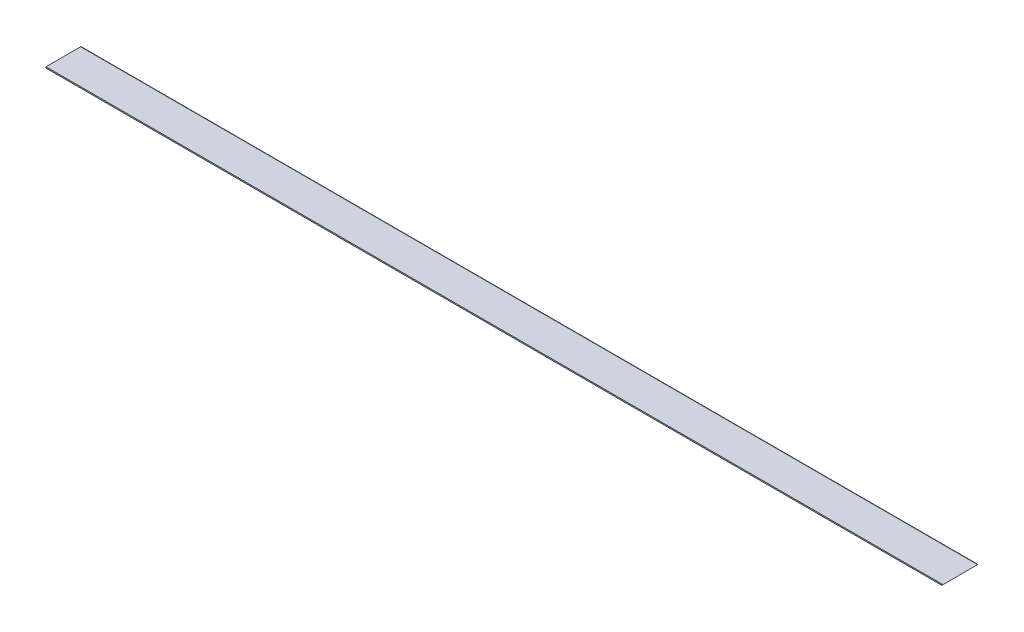
ISO-10303-21;
HEADER;
FILE_DESCRIPTION(('STEP AP214'),'2;1');
FILE_NAME('part.step','',(''),(''),'','','');
FILE_SCHEMA(('AUTOMOTIVE_DESIGN { 1 0 10303 214 1 1 1 1 }'));
ENDSEC;
DATA;
#1=APPLICATION_CONTEXT('core data for automotive mechanical design processes');
#2=APPLICATION_PROTOCOL_DEFINITION('international standard','automotive_design',2000,#1);
#3=PRODUCT_CONTEXT('',#1,'mechanical');
#4=PRODUCT('Part','Part','',(#3));
#5=PRODUCT_RELATED_PRODUCT_CATEGORY('part','',(#4));
#6=PRODUCT_DEFINITION_FORMATION('','',#4);
#7=PRODUCT_DEFINITION_CONTEXT('part definition',#1,'design');
#8=PRODUCT_DEFINITION('design','',#6,#7);
#9=PRODUCT_DEFINITION_SHAPE('','',#8);
#10=(LENGTH_UNIT() NAMED_UNIT(*) SI_UNIT(.MILLI.,.METRE.));
#11=(NAMED_UNIT(*) PLANE_ANGLE_UNIT() SI_UNIT($,.RADIAN.));
#12=(NAMED_UNIT(*) SI_UNIT($,.STERADIAN.) SOLID_ANGLE_UNIT());
#13=UNCERTAINTY_MEASURE_WITH_UNIT(LENGTH_MEASURE(1.E-05),#10,'distance_accuracy_value','');
#14=(GEOMETRIC_REPRESENTATION_CONTEXT(3) GLOBAL_UNCERTAINTY_ASSIGNED_CONTEXT((#13)) GLOBAL_UNIT_ASSIGNED_CONTEXT((#10,
#11,#12)) REPRESENTATION_CONTEXT('',''));
#15=CARTESIAN_POINT('',(0.,0.,0.));
#16=DIRECTION('',(0.,0.,1.));
#17=DIRECTION('',(1.,0.,0.));
#18=AXIS2_PLACEMENT_3D('',#15,#16,#17);
#19=CARTESIAN_POINT('',(2210.,0.,0.));
#20=DIRECTION('',(0.,0.,-1.));
#21=DIRECTION('',(-1.,0.,0.));
#22=AXIS2_PLACEMENT_3D('',#19,#20,#21);
#23=PLANE('',#22);
#24=DIRECTION('',(-1.,0.,0.));
#25=VECTOR('',#24,1.);
#26=CARTESIAN_POINT('',(2210.,-3.,0.));
#27=LINE('',#26,#25);
#28=CARTESIAN_POINT('',(2207.,-3.,0.));
#29=VERTEX_POINT('',#28);
#30=CARTESIAN_POINT('',(0.,-3.,0.));
#31=VERTEX_POINT('',#30);
#32=EDGE_CURVE('E113',#29,#31,#27,.T.);
#33=ORIENTED_EDGE('',*,*,#32,.F.);
#34=DIRECTION('',(0.707106781186544,0.707106781186551,0.));
#35=VECTOR('',#34,1.);
#36=CARTESIAN_POINT('',(2210.,0.,0.));
#37=LINE('',#36,#35);
#38=CARTESIAN_POINT('',(2210.,0.,0.));
#39=VERTEX_POINT('',#38);
#40=EDGE_CURVE('E99',#29,#39,#37,.T.);
#41=ORIENTED_EDGE('',*,*,#40,.T.);
#42=DIRECTION('',(-1.,0.,0.));
#43=VECTOR('',#42,1.);
#44=CARTESIAN_POINT('',(2210.,0.,0.));
#45=LINE('',#44,#43);
#46=CARTESIAN_POINT('',(0.,0.,0.));
#47=VERTEX_POINT('',#46);
#48=EDGE_CURVE('E105',#39,#47,#45,.T.);
#49=ORIENTED_EDGE('',*,*,#48,.T.);
#50=DIRECTION('',(0.,-1.,0.));
#51=VECTOR('',#50,1.);
#52=CARTESIAN_POINT('',(0.,0.,0.));
#53=LINE('',#52,#51);
#54=EDGE_CURVE('E150',#47,#31,#53,.T.);
#55=ORIENTED_EDGE('',*,*,#54,.T.);
#56=EDGE_LOOP('',(#33,#41,#49,#55));
#57=FACE_BOUND('',#56,.T.);
#58=ADVANCED_FACE('F33',(#57),#23,.F.);
#59=CARTESIAN_POINT('',(2210.,-3.,0.));
#60=DIRECTION('',(0.,1.,0.));
#61=DIRECTION('',(0.,0.,1.));
#62=AXIS2_PLACEMENT_3D('',#59,#60,#61);
#63=PLANE('',#62);
#64=DIRECTION('',(-1.,0.,0.));
#65=VECTOR('',#64,1.);
#66=CARTESIAN_POINT('',(2210.,-3.,-82.));
#67=LINE('',#66,#65);
#68=CARTESIAN_POINT('',(0.,-3.,-82.));
#69=VERTEX_POINT('',#68);
#70=CARTESIAN_POINT('',(2207.,-3.,-82.));
#71=VERTEX_POINT('',#70);
#72=EDGE_CURVE('E128',#69,#71,#67,.F.);
#73=ORIENTED_EDGE('',*,*,#72,.T.);
#74=DIRECTION('',(0.,0.,1.));
#75=VECTOR('',#74,1.);
#76=CARTESIAN_POINT('',(2207.,-3.,0.));
#77=LINE('',#76,#75);
#78=EDGE_CURVE('E158',#71,#29,#77,.T.);
#79=ORIENTED_EDGE('',*,*,#78,.T.);
#80=ORIENTED_EDGE('',*,*,#32,.T.);
#81=DIRECTION('',(0.,0.,-1.));
#82=VECTOR('',#81,1.);
#83=CARTESIAN_POINT('',(0.,-3.,0.));
#84=LINE('',#83,#82);
#85=EDGE_CURVE('E141',#31,#69,#84,.T.);
#86=ORIENTED_EDGE('',*,*,#85,.T.);
#87=EDGE_LOOP('',(#73,#79,#80,#86));
#88=FACE_BOUND('',#87,.T.);
#89=ADVANCED_FACE('F149',(#88),#63,.F.);
#90=CARTESIAN_POINT('',(2210.,-3.,-85.));
#91=DIRECTION('',(0.,0.,-1.));
#92=DIRECTION('',(-1.,0.,0.));
#93=AXIS2_PLACEMENT_3D('',#90,#91,#92);
#94=PLANE('',#93);
#95=DIRECTION('',(-1.,0.,0.));
#96=VECTOR('',#95,1.);
#97=CARTESIAN_POINT('',(2210.,-88.,-85.));
#98=LINE('',#97,#96);
#99=CARTESIAN_POINT('',(2122.,-88.,-85.));
#100=VERTEX_POINT('',#99);
#101=CARTESIAN_POINT('',(0.,-88.,-85.));
#102=VERTEX_POINT('',#101);
#103=EDGE_CURVE('E119',#100,#102,#98,.T.);
#104=ORIENTED_EDGE('',*,*,#103,.F.);
#105=DIRECTION('',(0.707106781186544,0.707106781186551,0.));
#106=VECTOR('',#105,1.);
#107=CARTESIAN_POINT('',(2208.5,-1.50000000000001,-85.));
#108=LINE('',#107,#106);
#109=CARTESIAN_POINT('',(2204.,-6.,-85.));
#110=VERTEX_POINT('',#109);
#111=EDGE_CURVE('E156',#100,#110,#108,.T.);
#112=ORIENTED_EDGE('',*,*,#111,.T.);
#113=DIRECTION('',(-1.,0.,0.));
#114=VECTOR('',#113,1.);
#115=CARTESIAN_POINT('',(0.,-6.,-85.));
#116=LINE('',#115,#114);
#117=CARTESIAN_POINT('',(0.,-6.,-85.));
#118=VERTEX_POINT('',#117);
#119=EDGE_CURVE('E126',#110,#118,#116,.T.);
#120=ORIENTED_EDGE('',*,*,#119,.T.);
#121=DIRECTION('',(0.,-1.,0.));
#122=VECTOR('',#121,1.);
#123=CARTESIAN_POINT('',(0.,-3.,-85.));
#124=LINE('',#123,#122);
#125=EDGE_CURVE('E144',#118,#102,#124,.T.);
#126=ORIENTED_EDGE('',*,*,#125,.T.);
#127=EDGE_LOOP('',(#104,#112,#120,#126));
#128=FACE_BOUND('',#127,.T.);
#129=ADVANCED_FACE('F185',(#128),#94,.F.);
#130=CARTESIAN_POINT('',(2210.,-88.,-85.));
#131=DIRECTION('',(0.,1.,0.));
#132=DIRECTION('',(0.,0.,1.));
#133=AXIS2_PLACEMENT_3D('',#130,#131,#132);
#134=PLANE('',#133);
#135=DIRECTION('',(-1.,0.,0.));
#136=VECTOR('',#135,1.);
#137=CARTESIAN_POINT('',(2210.,-88.,-88.));
#138=LINE('',#137,#136);
#139=CARTESIAN_POINT('',(2122.,-88.,-88.));
#140=VERTEX_POINT('',#139);
#141=CARTESIAN_POINT('',(0.,-88.,-88.));
#142=VERTEX_POINT('',#141);
#143=EDGE_CURVE('E117',#140,#142,#138,.T.);
#144=ORIENTED_EDGE('',*,*,#143,.F.);
#145=DIRECTION('',(0.,0.,-1.));
#146=VECTOR('',#145,1.);
#147=CARTESIAN_POINT('',(2122.,-88.,0.));
#148=LINE('',#147,#146);
#149=EDGE_CURVE('E114',#100,#140,#148,.T.);
#150=ORIENTED_EDGE('',*,*,#149,.F.);
#151=ORIENTED_EDGE('',*,*,#103,.T.);
#152=DIRECTION('',(0.,0.,-1.));
#153=VECTOR('',#152,1.);
#154=CARTESIAN_POINT('',(0.,-88.,-85.));
#155=LINE('',#154,#153);
#156=EDGE_CURVE('E166',#102,#142,#155,.T.);
#157=ORIENTED_EDGE('',*,*,#156,.T.);
#158=EDGE_LOOP('',(#144,#150,#151,#157));
#159=FACE_BOUND('',#158,.T.);
#160=ADVANCED_FACE('F190',(#159),#134,.F.);
#161=CARTESIAN_POINT('',(2210.,0.,-88.));
#162=DIRECTION('',(0.,0.,1.));
#163=DIRECTION('',(0.,-1.,0.));
#164=AXIS2_PLACEMENT_3D('',#161,#162,#163);
#165=PLANE('',#164);
#166=DIRECTION('',(-1.,0.,0.));
#167=VECTOR('',#166,1.);
#168=CARTESIAN_POINT('',(2210.,-3.,-88.));
#169=LINE('',#168,#167);
#170=CARTESIAN_POINT('',(0.,-3.,-88.));
#171=VERTEX_POINT('',#170);
#172=CARTESIAN_POINT('',(2207.,-3.,-88.));
#173=VERTEX_POINT('',#172);
#174=EDGE_CURVE('E134',#171,#173,#169,.F.);
#175=ORIENTED_EDGE('',*,*,#174,.T.);
#176=DIRECTION('',(0.707106781186544,0.707106781186551,0.));
#177=VECTOR('',#176,1.);
#178=CARTESIAN_POINT('',(2210.,0.,-88.));
#179=LINE('',#178,#177);
#180=EDGE_CURVE('E47',#140,#173,#179,.T.);
#181=ORIENTED_EDGE('',*,*,#180,.F.);
#182=ORIENTED_EDGE('',*,*,#143,.T.);
#183=DIRECTION('',(0.,1.,0.));
#184=VECTOR('',#183,1.);
#185=CARTESIAN_POINT('',(0.,0.,-88.));
#186=LINE('',#185,#184);
#187=EDGE_CURVE('E168',#142,#171,#186,.T.);
#188=ORIENTED_EDGE('',*,*,#187,.T.);
#189=EDGE_LOOP('',(#175,#181,#182,#188));
#190=FACE_BOUND('',#189,.T.);
#191=ADVANCED_FACE('F171',(#190),#165,.F.);
#192=CARTESIAN_POINT('',(2210.,0.,0.));
#193=DIRECTION('',(0.,-1.,0.));
#194=DIRECTION('',(0.,0.,-1.));
#195=AXIS2_PLACEMENT_3D('',#192,#193,#194);
#196=PLANE('',#195);
#197=DIRECTION('',(0.,0.,1.));
#198=VECTOR('',#197,1.);
#199=CARTESIAN_POINT('',(2210.,0.,0.));
#200=LINE('',#199,#198);
#201=CARTESIAN_POINT('',(2210.,0.,-85.));
#202=VERTEX_POINT('',#201);
#203=EDGE_CURVE('E96',#202,#39,#200,.T.);
#204=ORIENTED_EDGE('',*,*,#203,.F.);
#205=DIRECTION('',(-1.,0.,0.));
#206=VECTOR('',#205,1.);
#207=CARTESIAN_POINT('',(2210.,0.,-85.));
#208=LINE('',#207,#206);
#209=CARTESIAN_POINT('',(0.,0.,-85.));
#210=VERTEX_POINT('',#209);
#211=EDGE_CURVE('E131',#202,#210,#208,.T.);
#212=ORIENTED_EDGE('',*,*,#211,.T.);
#213=DIRECTION('',(0.,0.,1.));
#214=VECTOR('',#213,1.);
#215=CARTESIAN_POINT('',(0.,0.,0.));
#216=LINE('',#215,#214);
#217=EDGE_CURVE('E106',#210,#47,#216,.T.);
#218=ORIENTED_EDGE('',*,*,#217,.T.);
#219=ORIENTED_EDGE('',*,*,#48,.F.);
#220=EDGE_LOOP('',(#204,#212,#218,#219));
#221=FACE_BOUND('',#220,.T.);
#222=ADVANCED_FACE('F116',(#221),#196,.F.);
#223=CARTESIAN_POINT('',(0.,0.,0.));
#224=DIRECTION('',(1.,0.,0.));
#225=DIRECTION('',(0.,0.,-1.));
#226=AXIS2_PLACEMENT_3D('',#223,#224,#225);
#227=PLANE('',#226);
#228=ORIENTED_EDGE('',*,*,#217,.F.);
#229=CARTESIAN_POINT('',(0.,-3.,-85.));
#230=DIRECTION('',(1.,0.,0.));
#231=DIRECTION('',(0.,0.,-1.));
#232=AXIS2_PLACEMENT_3D('',#229,#230,#231);
#233=CIRCLE('',#232,3.);
#234=EDGE_CURVE('E55',#210,#171,#233,.F.);
#235=ORIENTED_EDGE('',*,*,#234,.T.);
#236=ORIENTED_EDGE('',*,*,#187,.F.);
#237=ORIENTED_EDGE('',*,*,#156,.F.);
#238=ORIENTED_EDGE('',*,*,#125,.F.);
#239=CARTESIAN_POINT('',(0.,-6.,-82.));
#240=DIRECTION('',(1.,0.,0.));
#241=DIRECTION('',(0.,0.,-1.));
#242=AXIS2_PLACEMENT_3D('',#239,#240,#241);
#243=CIRCLE('',#242,3.);
#244=EDGE_CURVE('E41',#118,#69,#243,.T.);
#245=ORIENTED_EDGE('',*,*,#244,.T.);
#246=ORIENTED_EDGE('',*,*,#85,.F.);
#247=ORIENTED_EDGE('',*,*,#54,.F.);
#248=EDGE_LOOP('',(#228,#235,#236,#237,#238,#245,#246,#247));
#249=FACE_BOUND('',#248,.T.);
#250=ADVANCED_FACE('F140',(#249),#227,.F.);
#251=CARTESIAN_POINT('',(2210.,-6.,-82.));
#252=DIRECTION('',(1.,0.,0.));
#253=DIRECTION('',(0.,0.,-1.));
#254=AXIS2_PLACEMENT_3D('',#251,#252,#253);
#255=CYLINDRICAL_SURFACE('',#254,3.);
#256=ORIENTED_EDGE('',*,*,#119,.F.);
#257=CARTESIAN_POINT('',(2204.,-6.,-82.));
#258=DIRECTION('',(-0.707106781186551,0.707106781186544,0.));
#259=DIRECTION('',(0.707106781186544,0.707106781186551,0.));
#260=AXIS2_PLACEMENT_3D('',#257,#258,#259);
#261=ELLIPSE('',#260,4.24264068711927,3.);
#262=EDGE_CURVE('E154',#110,#71,#261,.F.);
#263=ORIENTED_EDGE('',*,*,#262,.T.);
#264=ORIENTED_EDGE('',*,*,#72,.F.);
#265=ORIENTED_EDGE('',*,*,#244,.F.);
#266=EDGE_LOOP('',(#256,#263,#264,#265));
#267=FACE_BOUND('',#266,.T.);
#268=ADVANCED_FACE('F153',(#267),#255,.F.);
#269=CARTESIAN_POINT('',(2210.,-3.,-85.));
#270=DIRECTION('',(-1.,0.,0.));
#271=DIRECTION('',(0.,0.,1.));
#272=AXIS2_PLACEMENT_3D('',#269,#270,#271);
#273=CYLINDRICAL_SURFACE('',#272,3.);
#274=CARTESIAN_POINT('',(2207.,-3.,-85.));
#275=DIRECTION('',(-0.707106781186551,0.707106781186544,0.));
#276=DIRECTION('',(-0.707106781186544,-0.707106781186551,0.));
#277=AXIS2_PLACEMENT_3D('',#274,#275,#276);
#278=ELLIPSE('',#277,4.24264068711927,3.);
#279=EDGE_CURVE('E11',#173,#202,#278,.F.);
#280=ORIENTED_EDGE('',*,*,#279,.F.);
#281=ORIENTED_EDGE('',*,*,#174,.F.);
#282=ORIENTED_EDGE('',*,*,#234,.F.);
#283=ORIENTED_EDGE('',*,*,#211,.F.);
#284=EDGE_LOOP('',(#280,#281,#282,#283));
#285=FACE_BOUND('',#284,.T.);
#286=ADVANCED_FACE('F35',(#285),#273,.T.);
#287=CARTESIAN_POINT('',(2210.,0.,0.));
#288=DIRECTION('',(-0.707106781186551,0.707106781186544,0.));
#289=DIRECTION('',(-0.707106781186544,-0.707106781186551,0.));
#290=AXIS2_PLACEMENT_3D('',#287,#288,#289);
#291=PLANE('',#290);
#292=ORIENTED_EDGE('',*,*,#262,.F.);
#293=ORIENTED_EDGE('',*,*,#111,.F.);
#294=ORIENTED_EDGE('',*,*,#149,.T.);
#295=ORIENTED_EDGE('',*,*,#180,.T.);
#296=ORIENTED_EDGE('',*,*,#279,.T.);
#297=ORIENTED_EDGE('',*,*,#203,.T.);
#298=ORIENTED_EDGE('',*,*,#40,.F.);
#299=ORIENTED_EDGE('',*,*,#78,.F.);
#300=EDGE_LOOP('',(#292,#293,#294,#295,#296,#297,#298,#299));
#301=FACE_BOUND('',#300,.T.);
#302=ADVANCED_FACE('F98',(#301),#291,.F.);
#303=CLOSED_SHELL('',(#58,#89,#129,#160,#191,#222,#250,#268,#286,#302));
#304=MANIFOLD_SOLID_BREP('B2',#303);
#305=ADVANCED_BREP_SHAPE_REPRESENTATION('',(#18,#304),#14);
#306=SHAPE_DEFINITION_REPRESENTATION(#9,#305);
ENDSEC;
END-ISO-10303-21;
